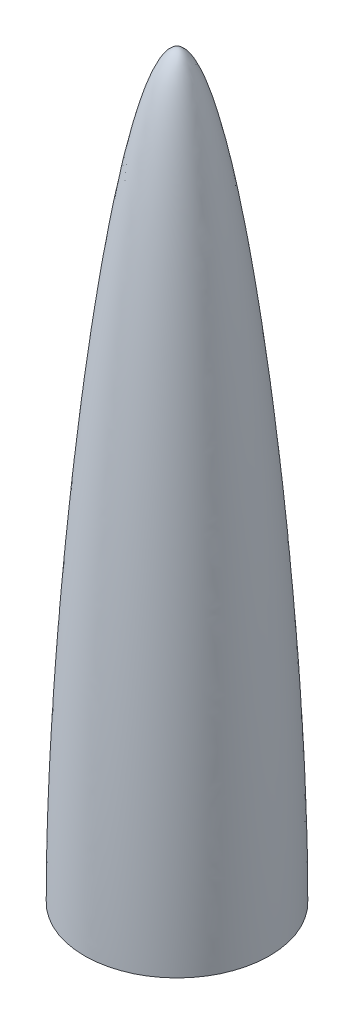
ISO-10303-21;
HEADER;
FILE_DESCRIPTION(('STEP AP214'),'2;1');
FILE_NAME('part.step','',(''),(''),'','','');
FILE_SCHEMA(('AUTOMOTIVE_DESIGN { 1 0 10303 214 1 1 1 1 }'));
ENDSEC;
DATA;
#1=APPLICATION_CONTEXT('core data for automotive mechanical design processes');
#2=APPLICATION_PROTOCOL_DEFINITION('international standard','automotive_design',2000,#1);
#3=PRODUCT_CONTEXT('',#1,'mechanical');
#4=PRODUCT('Part','Part','',(#3));
#5=PRODUCT_RELATED_PRODUCT_CATEGORY('part','',(#4));
#6=PRODUCT_DEFINITION_FORMATION('','',#4);
#7=PRODUCT_DEFINITION_CONTEXT('part definition',#1,'design');
#8=PRODUCT_DEFINITION('design','',#6,#7);
#9=PRODUCT_DEFINITION_SHAPE('','',#8);
#10=(LENGTH_UNIT() NAMED_UNIT(*) SI_UNIT(.MILLI.,.METRE.));
#11=(NAMED_UNIT(*) PLANE_ANGLE_UNIT() SI_UNIT($,.RADIAN.));
#12=(NAMED_UNIT(*) SI_UNIT($,.STERADIAN.) SOLID_ANGLE_UNIT());
#13=UNCERTAINTY_MEASURE_WITH_UNIT(LENGTH_MEASURE(1.E-05),#10,'distance_accuracy_value','');
#14=(GEOMETRIC_REPRESENTATION_CONTEXT(3) GLOBAL_UNCERTAINTY_ASSIGNED_CONTEXT((#13)) GLOBAL_UNIT_ASSIGNED_CONTEXT((#10,
#11,#12)) REPRESENTATION_CONTEXT('',''));
#15=CARTESIAN_POINT('',(0.,0.,0.));
#16=DIRECTION('',(0.,0.,1.));
#17=DIRECTION('',(1.,0.,0.));
#18=AXIS2_PLACEMENT_3D('',#15,#16,#17);
#19=CARTESIAN_POINT('',(4.1275,403.069458146955,0.));
#20=CARTESIAN_POINT('',(4.29202363713321,402.747413470771,0.));
#21=CARTESIAN_POINT('',(4.60563470180716,402.113699512921,0.));
#22=CARTESIAN_POINT('',(5.25902935705148,400.714319486589,0.));
#23=CARTESIAN_POINT('',(6.08052557233146,398.802814150954,0.));
#24=CARTESIAN_POINT('',(7.08012766076402,396.235904148973,0.));
#25=CARTESIAN_POINT('',(8.42081966262193,392.4721057004,0.));
#26=CARTESIAN_POINT('',(10.1053217106121,387.147151322801,0.));
#27=CARTESIAN_POINT('',(12.1235028418488,379.832445690583,0.));
#28=CARTESIAN_POINT('',(14.12884528873,371.651216829993,0.));
#29=CARTESIAN_POINT('',(16.7760228663702,359.660430734449,0.));
#30=CARTESIAN_POINT('',(20.0208705412657,342.773209039108,0.));
#31=CARTESIAN_POINT('',(23.7756069574677,319.87201384631,0.));
#32=CARTESIAN_POINT('',(27.3599431808325,294.724294429459,0.));
#33=CARTESIAN_POINT('',(30.7442314056049,267.71547718948,0.));
#34=CARTESIAN_POINT('',(33.8997186689304,239.228376580345,0.));
#35=CARTESIAN_POINT('',(36.7980675212827,209.644450358667,0.));
#36=CARTESIAN_POINT('',(39.4111777460924,179.344383779096,0.));
#37=CARTESIAN_POINT('',(41.7110865878509,148.708460892577,0.));
#38=CARTESIAN_POINT('',(43.669922699339,118.116805640907,0.));
#39=CARTESIAN_POINT('',(44.9948904247482,92.977467607808,0.));
#40=CARTESIAN_POINT('',(45.8565631571113,73.2684258988613,0.));
#41=CARTESIAN_POINT('',(46.4002098961938,58.7355322208369,0.));
#42=CARTESIAN_POINT('',(46.8377987892618,44.4989168954721,0.));
#43=CARTESIAN_POINT('',(47.1112048076291,32.9225396768806,0.));
#44=CARTESIAN_POINT('',(47.2734709517128,23.8560069142551,0.));
#45=CARTESIAN_POINT('',(47.3665007365304,17.1639997492888,0.));
#46=CARTESIAN_POINT('',(47.4304926424886,10.5670603563226,0.));
#47=CARTESIAN_POINT('',(47.4533698164017,6.28358059200904,0.));
#48=CARTESIAN_POINT('',(47.4599258416345,4.12750000000004,0.));
#49=B_SPLINE_CURVE_WITH_KNOTS('',3,(#19,#20,#21,#22,#23,#24,#25,#26,#27,#28,#29,#30,#31,#32,#33,
#34,#35,#36,#37,#38,#39,#40,#41,#42,#43,#44,#45,#46,#47,#48),.UNSPECIFIED.,.F.,.F.,(4,1,1,1,1,1,
1,1,1,1,1,1,1,1,1,1,1,1,1,1,1,1,1,1,1,1,1,4),(0.102456086431318,0.109397847786348,
0.116339609141378,0.130223131851438,0.144106654561499,0.157990177271559,0.18575722269168,
0.213524268111801,0.241291313531922,0.269058358952043,0.324592449792284,0.380126540632526,
0.435660631472768,0.491194722313009,0.546728813153251,0.602262903993492,0.657796994833734,
0.713331085673976,0.768865176514217,0.824399267354459,0.85216631277458,0.879933358194701,
0.907700403614822,0.935467449034942,0.949350971745003,0.963234494455063,0.977118017165124,
0.991001539875184),.UNSPECIFIED.);
#50=CARTESIAN_POINT('',(0.,433.3875,0.));
#51=DIRECTION('',(0.,1.,0.));
#52=AXIS1_PLACEMENT('',#50,#51);
#53=SURFACE_OF_REVOLUTION('',#49,#52);
#54=CARTESIAN_POINT('',(0.,4.12750000000006,0.));
#55=DIRECTION('',(0.,1.,0.));
#56=DIRECTION('',(0.,0.,1.));
#57=AXIS2_PLACEMENT_3D('',#54,#55,#56);
#58=CIRCLE('',#57,47.4599258416345);
#59=CARTESIAN_POINT('',(0.,4.12750000000006,47.4599258416345));
#60=VERTEX_POINT('',#59);
#61=EDGE_CURVE('E11',#60,#60,#58,.T.);
#62=ORIENTED_EDGE('',*,*,#61,.F.);
#63=EDGE_LOOP('',(#62));
#64=FACE_BOUND('',#63,.T.);
#65=CARTESIAN_POINT('',(0.,403.069458146955,0.));
#66=DIRECTION('',(0.,1.,0.));
#67=DIRECTION('',(0.,0.,1.));
#68=AXIS2_PLACEMENT_3D('',#65,#66,#67);
#69=CIRCLE('',#68,4.1275);
#70=CARTESIAN_POINT('',(0.,403.069458146955,4.1275));
#71=VERTEX_POINT('',#70);
#72=EDGE_CURVE('E65',#71,#71,#69,.T.);
#73=ORIENTED_EDGE('',*,*,#72,.T.);
#74=EDGE_LOOP('',(#73));
#75=FACE_BOUND('',#74,.T.);
#76=ADVANCED_FACE('F43',(#64,#75),#53,.T.);
#77=CARTESIAN_POINT('',(0.,433.3875,0.));
#78=DIRECTION('',(0.,1.,0.));
#79=DIRECTION('',(0.,0.,1.));
#80=AXIS2_PLACEMENT_3D('',#77,#78,#79);
#81=CYLINDRICAL_SURFACE('',#80,47.4599258416345);
#82=CARTESIAN_POINT('',(0.,0.,0.));
#83=DIRECTION('',(0.,1.,0.));
#84=DIRECTION('',(0.,0.,1.));
#85=AXIS2_PLACEMENT_3D('',#82,#83,#84);
#86=CIRCLE('',#85,47.4599258416345);
#87=CARTESIAN_POINT('',(0.,0.,47.4599258416345));
#88=VERTEX_POINT('',#87);
#89=EDGE_CURVE('E51',#88,#88,#86,.T.);
#90=ORIENTED_EDGE('',*,*,#89,.F.);
#91=EDGE_LOOP('',(#90));
#92=FACE_BOUND('',#91,.T.);
#93=ORIENTED_EDGE('',*,*,#61,.T.);
#94=EDGE_LOOP('',(#93));
#95=FACE_BOUND('',#94,.T.);
#96=ADVANCED_FACE('F85',(#92,#95),#81,.F.);
#97=CARTESIAN_POINT('',(47.4599258416345,0.,0.));
#98=DIRECTION('',(0.,1.,0.));
#99=DIRECTION('',(0.,0.,1.));
#100=AXIS2_PLACEMENT_3D('',#97,#98,#99);
#101=PLANE('',#100);
#102=CARTESIAN_POINT('',(0.,0.,0.));
#103=DIRECTION('',(0.,1.,0.));
#104=DIRECTION('',(0.,0.,1.));
#105=AXIS2_PLACEMENT_3D('',#102,#103,#104);
#106=CIRCLE('',#105,51.59375);
#107=CARTESIAN_POINT('',(0.,0.,51.59375));
#108=VERTEX_POINT('',#107);
#109=EDGE_CURVE('E62',#108,#108,#106,.T.);
#110=ORIENTED_EDGE('',*,*,#109,.F.);
#111=EDGE_LOOP('',(#110));
#112=FACE_BOUND('',#111,.T.);
#113=ORIENTED_EDGE('',*,*,#89,.T.);
#114=EDGE_LOOP('',(#113));
#115=FACE_BOUND('',#114,.T.);
#116=ADVANCED_FACE('F58',(#112,#115),#101,.F.);
#117=CARTESIAN_POINT('',(51.59375,0.,0.));
#118=CARTESIAN_POINT('',(51.59375,152.4,0.));
#119=CARTESIAN_POINT('',(25.4,412.75,0.));
#120=CARTESIAN_POINT('',(0.,412.75,0.));
#121=B_SPLINE_CURVE_WITH_KNOTS('',3,(#117,#118,#119,#120),.UNSPECIFIED.,.F.,.F.,(4,4),(0.,1.),.UNSPECIFIED.);
#122=CARTESIAN_POINT('',(0.,433.3875,0.));
#123=DIRECTION('',(0.,1.,0.));
#124=AXIS1_PLACEMENT('',#122,#123);
#125=SURFACE_OF_REVOLUTION('',#121,#124);
#126=CARTESIAN_POINT('',(0.,412.75,0.));
#127=VERTEX_POINT('',#126);
#128=VERTEX_LOOP('',#127);
#129=FACE_BOUND('',#128,.T.);
#130=ORIENTED_EDGE('',*,*,#109,.T.);
#131=EDGE_LOOP('',(#130));
#132=FACE_BOUND('',#131,.T.);
#133=ADVANCED_FACE('F54',(#129,#132),#125,.T.);
#134=CARTESIAN_POINT('',(4.1275,403.069458146955,0.));
#135=DIRECTION('',(0.,1.,0.));
#136=DIRECTION('',(0.,0.,1.));
#137=AXIS2_PLACEMENT_3D('',#134,#135,#136);
#138=PLANE('',#137);
#139=ORIENTED_EDGE('',*,*,#72,.F.);
#140=EDGE_LOOP('',(#139));
#141=FACE_BOUND('',#140,.T.);
#142=ADVANCED_FACE('F57',(#141),#138,.F.);
#143=CLOSED_SHELL('',(#76,#96,#116,#133,#142));
#144=MANIFOLD_SOLID_BREP('B2',#143);
#145=ADVANCED_BREP_SHAPE_REPRESENTATION('',(#18,#144),#14);
#146=SHAPE_DEFINITION_REPRESENTATION(#9,#145);
ENDSEC;
END-ISO-10303-21;
